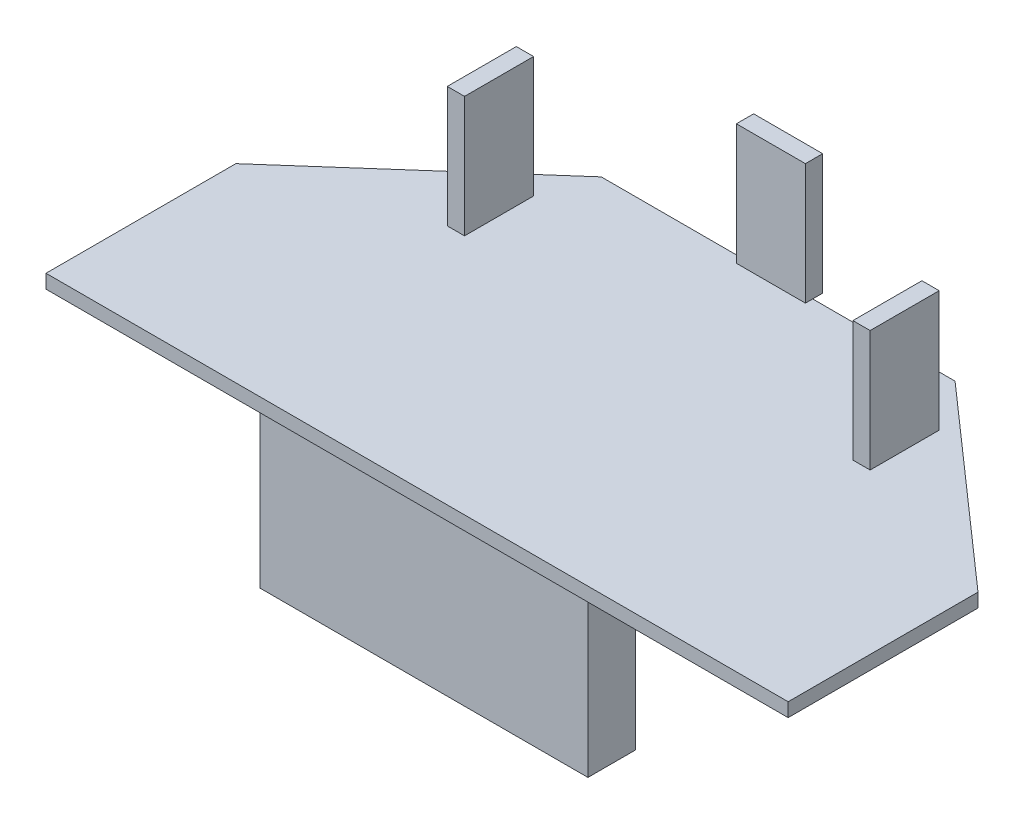
ISO-10303-21;
HEADER;
FILE_DESCRIPTION(('STEP AP214'),'2;1');
FILE_NAME('part.step','',(''),(''),'','','');
FILE_SCHEMA(('AUTOMOTIVE_DESIGN { 1 0 10303 214 1 1 1 1 }'));
ENDSEC;
DATA;
#1=APPLICATION_CONTEXT('core data for automotive mechanical design processes');
#2=APPLICATION_PROTOCOL_DEFINITION('international standard','automotive_design',2000,#1);
#3=PRODUCT_CONTEXT('',#1,'mechanical');
#4=PRODUCT('Part','Part','',(#3));
#5=PRODUCT_RELATED_PRODUCT_CATEGORY('part','',(#4));
#6=PRODUCT_DEFINITION_FORMATION('','',#4);
#7=PRODUCT_DEFINITION_CONTEXT('part definition',#1,'design');
#8=PRODUCT_DEFINITION('design','',#6,#7);
#9=PRODUCT_DEFINITION_SHAPE('','',#8);
#10=(LENGTH_UNIT() NAMED_UNIT(*) SI_UNIT(.MILLI.,.METRE.));
#11=(NAMED_UNIT(*) PLANE_ANGLE_UNIT() SI_UNIT($,.RADIAN.));
#12=(NAMED_UNIT(*) SI_UNIT($,.STERADIAN.) SOLID_ANGLE_UNIT());
#13=UNCERTAINTY_MEASURE_WITH_UNIT(LENGTH_MEASURE(1.E-05),#10,'distance_accuracy_value','');
#14=(GEOMETRIC_REPRESENTATION_CONTEXT(3) GLOBAL_UNCERTAINTY_ASSIGNED_CONTEXT((#13)) GLOBAL_UNIT_ASSIGNED_CONTEXT((#10,
#11,#12)) REPRESENTATION_CONTEXT('',''));
#15=CARTESIAN_POINT('',(0.,0.,0.));
#16=DIRECTION('',(0.,0.,1.));
#17=DIRECTION('',(1.,0.,0.));
#18=AXIS2_PLACEMENT_3D('',#15,#16,#17);
#19=CARTESIAN_POINT('',(0.,0.,0.));
#20=DIRECTION('',(0.,1.,0.));
#21=DIRECTION('',(0.,0.,1.));
#22=AXIS2_PLACEMENT_3D('',#19,#20,#21);
#23=PLANE('',#22);
#24=DIRECTION('',(0.,0.,-1.));
#25=VECTOR('',#24,1.);
#26=CARTESIAN_POINT('',(-22.5,0.,-28.));
#27=LINE('',#26,#25);
#28=CARTESIAN_POINT('',(-22.5,0.,-28.));
#29=VERTEX_POINT('',#28);
#30=CARTESIAN_POINT('',(-22.5,0.,-36.));
#31=VERTEX_POINT('',#30);
#32=EDGE_CURVE('E270',#29,#31,#27,.T.);
#33=ORIENTED_EDGE('',*,*,#32,.F.);
#34=DIRECTION('',(1.,0.,0.));
#35=VECTOR('',#34,1.);
#36=CARTESIAN_POINT('',(-24.5,0.,-28.));
#37=LINE('',#36,#35);
#38=CARTESIAN_POINT('',(-24.5,0.,-28.));
#39=VERTEX_POINT('',#38);
#40=EDGE_CURVE('E256',#39,#29,#37,.T.);
#41=ORIENTED_EDGE('',*,*,#40,.F.);
#42=DIRECTION('',(0.,0.,1.));
#43=VECTOR('',#42,1.);
#44=CARTESIAN_POINT('',(-24.5,0.,-36.));
#45=LINE('',#44,#43);
#46=CARTESIAN_POINT('',(-24.5,0.,-36.));
#47=VERTEX_POINT('',#46);
#48=EDGE_CURVE('E261',#47,#39,#45,.T.);
#49=ORIENTED_EDGE('',*,*,#48,.F.);
#50=DIRECTION('',(-1.,0.,0.));
#51=VECTOR('',#50,1.);
#52=CARTESIAN_POINT('',(-22.5,0.,-36.));
#53=LINE('',#52,#51);
#54=EDGE_CURVE('E272',#31,#47,#53,.T.);
#55=ORIENTED_EDGE('',*,*,#54,.F.);
#56=EDGE_LOOP('',(#33,#41,#49,#55));
#57=FACE_BOUND('',#56,.T.);
#58=DIRECTION('',(1.,0.,0.));
#59=VECTOR('',#58,1.);
#60=CARTESIAN_POINT('',(-4.,0.,-41.));
#61=LINE('',#60,#59);
#62=CARTESIAN_POINT('',(-4.,0.,-41.));
#63=VERTEX_POINT('',#62);
#64=CARTESIAN_POINT('',(4.,0.,-41.));
#65=VERTEX_POINT('',#64);
#66=EDGE_CURVE('E62',#63,#65,#61,.T.);
#67=ORIENTED_EDGE('',*,*,#66,.F.);
#68=DIRECTION('',(0.,0.,1.));
#69=VECTOR('',#68,1.);
#70=CARTESIAN_POINT('',(-4.,0.,-43.));
#71=LINE('',#70,#69);
#72=CARTESIAN_POINT('',(-4.,0.,-41.8431348329844));
#73=VERTEX_POINT('',#72);
#74=EDGE_CURVE('E220',#73,#63,#71,.T.);
#75=ORIENTED_EDGE('',*,*,#74,.F.);
#76=DIRECTION('',(-1.,0.,0.));
#77=VECTOR('',#76,1.);
#78=CARTESIAN_POINT('',(20.5,0.,-41.8431348329844));
#79=LINE('',#78,#77);
#80=CARTESIAN_POINT('',(-20.5,0.,-41.8431348329844));
#81=VERTEX_POINT('',#80);
#82=EDGE_CURVE('E316',#73,#81,#79,.T.);
#83=ORIENTED_EDGE('',*,*,#82,.T.);
#84=DIRECTION('',(-0.75,0.,0.661437827766148));
#85=VECTOR('',#84,1.);
#86=CARTESIAN_POINT('',(-20.5,0.,-41.8431348329844));
#87=LINE('',#86,#85);
#88=CARTESIAN_POINT('',(-43.,0.,-22.));
#89=VERTEX_POINT('',#88);
#90=EDGE_CURVE('E320',#81,#89,#87,.T.);
#91=ORIENTED_EDGE('',*,*,#90,.T.);
#92=DIRECTION('',(0.,0.,1.));
#93=VECTOR('',#92,1.);
#94=CARTESIAN_POINT('',(-43.,0.,-22.));
#95=LINE('',#94,#93);
#96=CARTESIAN_POINT('',(-43.,0.,0.));
#97=VERTEX_POINT('',#96);
#98=EDGE_CURVE('E306',#89,#97,#95,.T.);
#99=ORIENTED_EDGE('',*,*,#98,.T.);
#100=DIRECTION('',(1.,0.,0.));
#101=VECTOR('',#100,1.);
#102=CARTESIAN_POINT('',(-43.,0.,0.));
#103=LINE('',#102,#101);
#104=CARTESIAN_POINT('',(43.,0.,0.));
#105=VERTEX_POINT('',#104);
#106=EDGE_CURVE('E309',#97,#105,#103,.T.);
#107=ORIENTED_EDGE('',*,*,#106,.T.);
#108=DIRECTION('',(0.,0.,-1.));
#109=VECTOR('',#108,1.);
#110=CARTESIAN_POINT('',(43.,0.,0.));
#111=LINE('',#110,#109);
#112=CARTESIAN_POINT('',(43.,0.,-22.));
#113=VERTEX_POINT('',#112);
#114=EDGE_CURVE('E312',#105,#113,#111,.T.);
#115=ORIENTED_EDGE('',*,*,#114,.T.);
#116=DIRECTION('',(-0.75,0.,-0.661437827766148));
#117=VECTOR('',#116,1.);
#118=CARTESIAN_POINT('',(43.,0.,-22.));
#119=LINE('',#118,#117);
#120=CARTESIAN_POINT('',(20.5,0.,-41.8431348329844));
#121=VERTEX_POINT('',#120);
#122=EDGE_CURVE('E314',#113,#121,#119,.T.);
#123=ORIENTED_EDGE('',*,*,#122,.T.);
#124=CARTESIAN_POINT('',(4.,0.,-41.8431348329844));
#125=VERTEX_POINT('',#124);
#126=EDGE_CURVE('E317',#121,#125,#79,.T.);
#127=ORIENTED_EDGE('',*,*,#126,.T.);
#128=DIRECTION('',(0.,0.,-1.));
#129=VECTOR('',#128,1.);
#130=CARTESIAN_POINT('',(4.,0.,-41.));
#131=LINE('',#130,#129);
#132=EDGE_CURVE('E241',#65,#125,#131,.T.);
#133=ORIENTED_EDGE('',*,*,#132,.F.);
#134=EDGE_LOOP('',(#67,#75,#83,#91,#99,#107,#115,#123,#127,#133));
#135=FACE_BOUND('',#134,.T.);
#136=DIRECTION('',(0.,0.,1.));
#137=VECTOR('',#136,1.);
#138=CARTESIAN_POINT('',(22.5,0.,-36.));
#139=LINE('',#138,#137);
#140=CARTESIAN_POINT('',(22.5,0.,-36.));
#141=VERTEX_POINT('',#140);
#142=CARTESIAN_POINT('',(22.5,0.,-28.));
#143=VERTEX_POINT('',#142);
#144=EDGE_CURVE('E621',#141,#143,#139,.T.);
#145=ORIENTED_EDGE('',*,*,#144,.F.);
#146=DIRECTION('',(-1.,0.,0.));
#147=VECTOR('',#146,1.);
#148=CARTESIAN_POINT('',(24.5,0.,-36.));
#149=LINE('',#148,#147);
#150=CARTESIAN_POINT('',(24.5,0.,-36.));
#151=VERTEX_POINT('',#150);
#152=EDGE_CURVE('E218',#151,#141,#149,.T.);
#153=ORIENTED_EDGE('',*,*,#152,.F.);
#154=DIRECTION('',(0.,0.,-1.));
#155=VECTOR('',#154,1.);
#156=CARTESIAN_POINT('',(24.5,0.,-28.));
#157=LINE('',#156,#155);
#158=CARTESIAN_POINT('',(24.5,0.,-28.));
#159=VERTEX_POINT('',#158);
#160=EDGE_CURVE('E214',#159,#151,#157,.T.);
#161=ORIENTED_EDGE('',*,*,#160,.F.);
#162=DIRECTION('',(1.,0.,0.));
#163=VECTOR('',#162,1.);
#164=CARTESIAN_POINT('',(22.5,0.,-28.));
#165=LINE('',#164,#163);
#166=EDGE_CURVE('E618',#143,#159,#165,.T.);
#167=ORIENTED_EDGE('',*,*,#166,.F.);
#168=EDGE_LOOP('',(#145,#153,#161,#167));
#169=FACE_BOUND('',#168,.T.);
#170=ADVANCED_FACE('F39',(#57,#135,#169),#23,.T.);
#171=CARTESIAN_POINT('',(0.,-1.6,0.));
#172=DIRECTION('',(0.,1.,0.));
#173=DIRECTION('',(0.,0.,1.));
#174=AXIS2_PLACEMENT_3D('',#171,#172,#173);
#175=PLANE('',#174);
#176=DIRECTION('',(0.,0.,1.));
#177=VECTOR('',#176,1.);
#178=CARTESIAN_POINT('',(-43.,-1.6,-22.));
#179=LINE('',#178,#177);
#180=CARTESIAN_POINT('',(-43.,-1.6,-22.));
#181=VERTEX_POINT('',#180);
#182=CARTESIAN_POINT('',(-43.,-1.6,0.));
#183=VERTEX_POINT('',#182);
#184=EDGE_CURVE('E305',#181,#183,#179,.T.);
#185=ORIENTED_EDGE('',*,*,#184,.F.);
#186=DIRECTION('',(-0.75,0.,0.661437827766148));
#187=VECTOR('',#186,1.);
#188=CARTESIAN_POINT('',(-20.5,-1.6,-41.8431348329844));
#189=LINE('',#188,#187);
#190=CARTESIAN_POINT('',(-20.5,-1.6,-41.8431348329844));
#191=VERTEX_POINT('',#190);
#192=EDGE_CURVE('E310',#191,#181,#189,.T.);
#193=ORIENTED_EDGE('',*,*,#192,.F.);
#194=DIRECTION('',(-1.,0.,0.));
#195=VECTOR('',#194,1.);
#196=CARTESIAN_POINT('',(20.5,-1.6,-41.8431348329844));
#197=LINE('',#196,#195);
#198=CARTESIAN_POINT('',(20.5,-1.6,-41.8431348329844));
#199=VERTEX_POINT('',#198);
#200=EDGE_CURVE('E332',#199,#191,#197,.T.);
#201=ORIENTED_EDGE('',*,*,#200,.F.);
#202=DIRECTION('',(-0.75,0.,-0.661437827766148));
#203=VECTOR('',#202,1.);
#204=CARTESIAN_POINT('',(43.,-1.6,-22.));
#205=LINE('',#204,#203);
#206=CARTESIAN_POINT('',(43.,-1.6,-22.));
#207=VERTEX_POINT('',#206);
#208=EDGE_CURVE('E330',#207,#199,#205,.T.);
#209=ORIENTED_EDGE('',*,*,#208,.F.);
#210=DIRECTION('',(0.,0.,-1.));
#211=VECTOR('',#210,1.);
#212=CARTESIAN_POINT('',(43.,-1.6,0.));
#213=LINE('',#212,#211);
#214=CARTESIAN_POINT('',(43.,-1.6,0.));
#215=VERTEX_POINT('',#214);
#216=EDGE_CURVE('E328',#215,#207,#213,.T.);
#217=ORIENTED_EDGE('',*,*,#216,.F.);
#218=DIRECTION('',(1.,0.,0.));
#219=VECTOR('',#218,1.);
#220=CARTESIAN_POINT('',(-43.,-1.6,0.));
#221=LINE('',#220,#219);
#222=EDGE_CURVE('E326',#183,#215,#221,.T.);
#223=ORIENTED_EDGE('',*,*,#222,.F.);
#224=EDGE_LOOP('',(#185,#193,#201,#209,#217,#223));
#225=FACE_BOUND('',#224,.T.);
#226=DIRECTION('',(0.,0.,-1.));
#227=VECTOR('',#226,1.);
#228=CARTESIAN_POINT('',(-19.,-1.6,0.));
#229=LINE('',#228,#227);
#230=CARTESIAN_POINT('',(-19.,-1.6,-0.8));
#231=VERTEX_POINT('',#230);
#232=CARTESIAN_POINT('',(-19.,-1.6,-6.3));
#233=VERTEX_POINT('',#232);
#234=EDGE_CURVE('E11',#231,#233,#229,.T.);
#235=ORIENTED_EDGE('',*,*,#234,.F.);
#236=DIRECTION('',(-1.,0.,0.));
#237=VECTOR('',#236,1.);
#238=CARTESIAN_POINT('',(0.,-1.6,-0.8));
#239=LINE('',#238,#237);
#240=CARTESIAN_POINT('',(19.,-1.6,-0.8));
#241=VERTEX_POINT('',#240);
#242=EDGE_CURVE('E47',#241,#231,#239,.T.);
#243=ORIENTED_EDGE('',*,*,#242,.F.);
#244=DIRECTION('',(0.,0.,1.));
#245=VECTOR('',#244,1.);
#246=CARTESIAN_POINT('',(19.,-1.6,0.));
#247=LINE('',#246,#245);
#248=CARTESIAN_POINT('',(19.,-1.6,-6.3));
#249=VERTEX_POINT('',#248);
#250=EDGE_CURVE('E355',#249,#241,#247,.T.);
#251=ORIENTED_EDGE('',*,*,#250,.F.);
#252=DIRECTION('',(1.,0.,0.));
#253=VECTOR('',#252,1.);
#254=CARTESIAN_POINT('',(0.,-1.6,-6.3));
#255=LINE('',#254,#253);
#256=EDGE_CURVE('E352',#233,#249,#255,.T.);
#257=ORIENTED_EDGE('',*,*,#256,.F.);
#258=EDGE_LOOP('',(#235,#243,#251,#257));
#259=FACE_BOUND('',#258,.T.);
#260=ADVANCED_FACE('F375',(#225,#259),#175,.F.);
#261=CARTESIAN_POINT('',(-43.,0.,-22.));
#262=DIRECTION('',(1.,0.,0.));
#263=DIRECTION('',(0.,0.,-1.));
#264=AXIS2_PLACEMENT_3D('',#261,#262,#263);
#265=PLANE('',#264);
#266=ORIENTED_EDGE('',*,*,#184,.T.);
#267=DIRECTION('',(0.,-1.,0.));
#268=VECTOR('',#267,1.);
#269=CARTESIAN_POINT('',(-43.,0.,0.));
#270=LINE('',#269,#268);
#271=EDGE_CURVE('E349',#97,#183,#270,.T.);
#272=ORIENTED_EDGE('',*,*,#271,.F.);
#273=ORIENTED_EDGE('',*,*,#98,.F.);
#274=DIRECTION('',(0.,-1.,0.));
#275=VECTOR('',#274,1.);
#276=CARTESIAN_POINT('',(-43.,0.,-22.));
#277=LINE('',#276,#275);
#278=EDGE_CURVE('E323',#89,#181,#277,.T.);
#279=ORIENTED_EDGE('',*,*,#278,.T.);
#280=EDGE_LOOP('',(#266,#272,#273,#279));
#281=FACE_BOUND('',#280,.T.);
#282=ADVANCED_FACE('F41',(#281),#265,.F.);
#283=CARTESIAN_POINT('',(-43.,0.,0.));
#284=DIRECTION('',(0.,0.,-1.));
#285=DIRECTION('',(-1.,0.,0.));
#286=AXIS2_PLACEMENT_3D('',#283,#284,#285);
#287=PLANE('',#286);
#288=ORIENTED_EDGE('',*,*,#222,.T.);
#289=DIRECTION('',(0.,-1.,0.));
#290=VECTOR('',#289,1.);
#291=CARTESIAN_POINT('',(43.,0.,0.));
#292=LINE('',#291,#290);
#293=EDGE_CURVE('E346',#105,#215,#292,.T.);
#294=ORIENTED_EDGE('',*,*,#293,.F.);
#295=ORIENTED_EDGE('',*,*,#106,.F.);
#296=ORIENTED_EDGE('',*,*,#271,.T.);
#297=EDGE_LOOP('',(#288,#294,#295,#296));
#298=FACE_BOUND('',#297,.T.);
#299=ADVANCED_FACE('F415',(#298),#287,.F.);
#300=CARTESIAN_POINT('',(43.,0.,0.));
#301=DIRECTION('',(-1.,0.,0.));
#302=DIRECTION('',(0.,0.,1.));
#303=AXIS2_PLACEMENT_3D('',#300,#301,#302);
#304=PLANE('',#303);
#305=ORIENTED_EDGE('',*,*,#216,.T.);
#306=DIRECTION('',(0.,-1.,0.));
#307=VECTOR('',#306,1.);
#308=CARTESIAN_POINT('',(43.,0.,-22.));
#309=LINE('',#308,#307);
#310=EDGE_CURVE('E343',#113,#207,#309,.T.);
#311=ORIENTED_EDGE('',*,*,#310,.F.);
#312=ORIENTED_EDGE('',*,*,#114,.F.);
#313=ORIENTED_EDGE('',*,*,#293,.T.);
#314=EDGE_LOOP('',(#305,#311,#312,#313));
#315=FACE_BOUND('',#314,.T.);
#316=ADVANCED_FACE('F412',(#315),#304,.F.);
#317=CARTESIAN_POINT('',(43.,0.,-22.));
#318=DIRECTION('',(-0.661437827766148,0.,0.75));
#319=DIRECTION('',(0.75,0.,0.661437827766148));
#320=AXIS2_PLACEMENT_3D('',#317,#318,#319);
#321=PLANE('',#320);
#322=ORIENTED_EDGE('',*,*,#208,.T.);
#323=DIRECTION('',(0.,-1.,0.));
#324=VECTOR('',#323,1.);
#325=CARTESIAN_POINT('',(20.5,0.,-41.8431348329844));
#326=LINE('',#325,#324);
#327=EDGE_CURVE('E340',#121,#199,#326,.T.);
#328=ORIENTED_EDGE('',*,*,#327,.F.);
#329=ORIENTED_EDGE('',*,*,#122,.F.);
#330=ORIENTED_EDGE('',*,*,#310,.T.);
#331=EDGE_LOOP('',(#322,#328,#329,#330));
#332=FACE_BOUND('',#331,.T.);
#333=ADVANCED_FACE('F408',(#332),#321,.F.);
#334=CARTESIAN_POINT('',(20.5,0.,-41.8431348329844));
#335=DIRECTION('',(0.,0.,1.));
#336=DIRECTION('',(1.,0.,0.));
#337=AXIS2_PLACEMENT_3D('',#334,#335,#336);
#338=PLANE('',#337);
#339=ORIENTED_EDGE('',*,*,#200,.T.);
#340=DIRECTION('',(0.,-1.,0.));
#341=VECTOR('',#340,1.);
#342=CARTESIAN_POINT('',(-20.5,0.,-41.8431348329844));
#343=LINE('',#342,#341);
#344=EDGE_CURVE('E337',#81,#191,#343,.T.);
#345=ORIENTED_EDGE('',*,*,#344,.F.);
#346=ORIENTED_EDGE('',*,*,#82,.F.);
#347=EDGE_CURVE('E321',#125,#73,#79,.T.);
#348=ORIENTED_EDGE('',*,*,#347,.F.);
#349=ORIENTED_EDGE('',*,*,#126,.F.);
#350=ORIENTED_EDGE('',*,*,#327,.T.);
#351=EDGE_LOOP('',(#339,#345,#346,#348,#349,#350));
#352=FACE_BOUND('',#351,.T.);
#353=ADVANCED_FACE('F404',(#352),#338,.F.);
#354=CARTESIAN_POINT('',(-20.5,0.,-41.8431348329844));
#355=DIRECTION('',(0.661437827766148,0.,0.75));
#356=DIRECTION('',(0.75,0.,-0.661437827766148));
#357=AXIS2_PLACEMENT_3D('',#354,#355,#356);
#358=PLANE('',#357);
#359=ORIENTED_EDGE('',*,*,#192,.T.);
#360=ORIENTED_EDGE('',*,*,#278,.F.);
#361=ORIENTED_EDGE('',*,*,#90,.F.);
#362=ORIENTED_EDGE('',*,*,#344,.T.);
#363=EDGE_LOOP('',(#359,#360,#361,#362));
#364=FACE_BOUND('',#363,.T.);
#365=ADVANCED_FACE('F401',(#364),#358,.F.);
#366=CARTESIAN_POINT('',(-19.,0.,-6.3));
#367=DIRECTION('',(1.,0.,0.));
#368=DIRECTION('',(0.,0.,-1.));
#369=AXIS2_PLACEMENT_3D('',#366,#367,#368);
#370=PLANE('',#369);
#371=DIRECTION('',(0.,-1.,0.));
#372=VECTOR('',#371,1.);
#373=CARTESIAN_POINT('',(-19.,0.,-0.8));
#374=LINE('',#373,#372);
#375=CARTESIAN_POINT('',(-19.,-20.,-0.8));
#376=VERTEX_POINT('',#375);
#377=EDGE_CURVE('E303',#231,#376,#374,.T.);
#378=ORIENTED_EDGE('',*,*,#377,.F.);
#379=ORIENTED_EDGE('',*,*,#234,.T.);
#380=DIRECTION('',(0.,-1.,0.));
#381=VECTOR('',#380,1.);
#382=CARTESIAN_POINT('',(-19.,0.,-6.3));
#383=LINE('',#382,#381);
#384=CARTESIAN_POINT('',(-19.,-20.,-6.3));
#385=VERTEX_POINT('',#384);
#386=EDGE_CURVE('E297',#233,#385,#383,.T.);
#387=ORIENTED_EDGE('',*,*,#386,.T.);
#388=DIRECTION('',(0.,0.,1.));
#389=VECTOR('',#388,1.);
#390=CARTESIAN_POINT('',(-19.,-20.,-6.3));
#391=LINE('',#390,#389);
#392=EDGE_CURVE('E285',#385,#376,#391,.T.);
#393=ORIENTED_EDGE('',*,*,#392,.T.);
#394=EDGE_LOOP('',(#378,#379,#387,#393));
#395=FACE_BOUND('',#394,.T.);
#396=ADVANCED_FACE('F365',(#395),#370,.F.);
#397=CARTESIAN_POINT('',(-19.,0.,-0.8));
#398=DIRECTION('',(0.,0.,-1.));
#399=DIRECTION('',(-1.,0.,0.));
#400=AXIS2_PLACEMENT_3D('',#397,#398,#399);
#401=PLANE('',#400);
#402=DIRECTION('',(0.,-1.,0.));
#403=VECTOR('',#402,1.);
#404=CARTESIAN_POINT('',(19.,0.,-0.8));
#405=LINE('',#404,#403);
#406=CARTESIAN_POINT('',(19.,-20.,-0.8));
#407=VERTEX_POINT('',#406);
#408=EDGE_CURVE('E301',#241,#407,#405,.T.);
#409=ORIENTED_EDGE('',*,*,#408,.F.);
#410=ORIENTED_EDGE('',*,*,#242,.T.);
#411=ORIENTED_EDGE('',*,*,#377,.T.);
#412=DIRECTION('',(1.,0.,0.));
#413=VECTOR('',#412,1.);
#414=CARTESIAN_POINT('',(-19.,-20.,-0.8));
#415=LINE('',#414,#413);
#416=EDGE_CURVE('E288',#376,#407,#415,.T.);
#417=ORIENTED_EDGE('',*,*,#416,.T.);
#418=EDGE_LOOP('',(#409,#410,#411,#417));
#419=FACE_BOUND('',#418,.T.);
#420=ADVANCED_FACE('F361',(#419),#401,.F.);
#421=CARTESIAN_POINT('',(19.,0.,-0.8));
#422=DIRECTION('',(-1.,0.,0.));
#423=DIRECTION('',(0.,0.,1.));
#424=AXIS2_PLACEMENT_3D('',#421,#422,#423);
#425=PLANE('',#424);
#426=DIRECTION('',(0.,-1.,0.));
#427=VECTOR('',#426,1.);
#428=CARTESIAN_POINT('',(19.,0.,-6.3));
#429=LINE('',#428,#427);
#430=CARTESIAN_POINT('',(19.,-20.,-6.3));
#431=VERTEX_POINT('',#430);
#432=EDGE_CURVE('E299',#249,#431,#429,.T.);
#433=ORIENTED_EDGE('',*,*,#432,.F.);
#434=ORIENTED_EDGE('',*,*,#250,.T.);
#435=ORIENTED_EDGE('',*,*,#408,.T.);
#436=DIRECTION('',(0.,0.,-1.));
#437=VECTOR('',#436,1.);
#438=CARTESIAN_POINT('',(19.,-20.,-0.8));
#439=LINE('',#438,#437);
#440=EDGE_CURVE('E291',#407,#431,#439,.T.);
#441=ORIENTED_EDGE('',*,*,#440,.T.);
#442=EDGE_LOOP('',(#433,#434,#435,#441));
#443=FACE_BOUND('',#442,.T.);
#444=ADVANCED_FACE('F374',(#443),#425,.F.);
#445=CARTESIAN_POINT('',(19.,0.,-6.3));
#446=DIRECTION('',(0.,0.,1.));
#447=DIRECTION('',(1.,0.,0.));
#448=AXIS2_PLACEMENT_3D('',#445,#446,#447);
#449=PLANE('',#448);
#450=ORIENTED_EDGE('',*,*,#386,.F.);
#451=ORIENTED_EDGE('',*,*,#256,.T.);
#452=ORIENTED_EDGE('',*,*,#432,.T.);
#453=DIRECTION('',(-1.,0.,0.));
#454=VECTOR('',#453,1.);
#455=CARTESIAN_POINT('',(19.,-20.,-6.3));
#456=LINE('',#455,#454);
#457=EDGE_CURVE('E294',#431,#385,#456,.T.);
#458=ORIENTED_EDGE('',*,*,#457,.T.);
#459=EDGE_LOOP('',(#450,#451,#452,#458));
#460=FACE_BOUND('',#459,.T.);
#461=ADVANCED_FACE('F377',(#460),#449,.F.);
#462=CARTESIAN_POINT('',(0.,-20.,0.));
#463=DIRECTION('',(0.,1.,0.));
#464=DIRECTION('',(0.,0.,1.));
#465=AXIS2_PLACEMENT_3D('',#462,#463,#464);
#466=PLANE('',#465);
#467=ORIENTED_EDGE('',*,*,#392,.F.);
#468=ORIENTED_EDGE('',*,*,#457,.F.);
#469=ORIENTED_EDGE('',*,*,#440,.F.);
#470=ORIENTED_EDGE('',*,*,#416,.F.);
#471=EDGE_LOOP('',(#467,#468,#469,#470));
#472=FACE_BOUND('',#471,.T.);
#473=ADVANCED_FACE('F370',(#472),#466,.F.);
#474=CARTESIAN_POINT('',(-24.5,14.,-28.));
#475=DIRECTION('',(0.,0.,-1.));
#476=DIRECTION('',(-1.,0.,0.));
#477=AXIS2_PLACEMENT_3D('',#474,#475,#476);
#478=PLANE('',#477);
#479=ORIENTED_EDGE('',*,*,#40,.T.);
#480=DIRECTION('',(0.,-1.,0.));
#481=VECTOR('',#480,1.);
#482=CARTESIAN_POINT('',(-22.5,14.,-28.));
#483=LINE('',#482,#481);
#484=CARTESIAN_POINT('',(-22.5,14.,-28.));
#485=VERTEX_POINT('',#484);
#486=EDGE_CURVE('E283',#485,#29,#483,.T.);
#487=ORIENTED_EDGE('',*,*,#486,.F.);
#488=DIRECTION('',(1.,0.,0.));
#489=VECTOR('',#488,1.);
#490=CARTESIAN_POINT('',(-24.5,14.,-28.));
#491=LINE('',#490,#489);
#492=CARTESIAN_POINT('',(-24.5,14.,-28.));
#493=VERTEX_POINT('',#492);
#494=EDGE_CURVE('E257',#493,#485,#491,.T.);
#495=ORIENTED_EDGE('',*,*,#494,.F.);
#496=DIRECTION('',(0.,-1.,0.));
#497=VECTOR('',#496,1.);
#498=CARTESIAN_POINT('',(-24.5,14.,-28.));
#499=LINE('',#498,#497);
#500=EDGE_CURVE('E267',#493,#39,#499,.T.);
#501=ORIENTED_EDGE('',*,*,#500,.T.);
#502=EDGE_LOOP('',(#479,#487,#495,#501));
#503=FACE_BOUND('',#502,.T.);
#504=ADVANCED_FACE('F384',(#503),#478,.F.);
#505=CARTESIAN_POINT('',(-22.5,14.,-28.));
#506=DIRECTION('',(-1.,0.,0.));
#507=DIRECTION('',(0.,0.,1.));
#508=AXIS2_PLACEMENT_3D('',#505,#506,#507);
#509=PLANE('',#508);
#510=ORIENTED_EDGE('',*,*,#32,.T.);
#511=DIRECTION('',(0.,-1.,0.));
#512=VECTOR('',#511,1.);
#513=CARTESIAN_POINT('',(-22.5,14.,-36.));
#514=LINE('',#513,#512);
#515=CARTESIAN_POINT('',(-22.5,14.,-36.));
#516=VERTEX_POINT('',#515);
#517=EDGE_CURVE('E280',#516,#31,#514,.T.);
#518=ORIENTED_EDGE('',*,*,#517,.F.);
#519=DIRECTION('',(0.,0.,-1.));
#520=VECTOR('',#519,1.);
#521=CARTESIAN_POINT('',(-22.5,14.,-28.));
#522=LINE('',#521,#520);
#523=EDGE_CURVE('E260',#485,#516,#522,.T.);
#524=ORIENTED_EDGE('',*,*,#523,.F.);
#525=ORIENTED_EDGE('',*,*,#486,.T.);
#526=EDGE_LOOP('',(#510,#518,#524,#525));
#527=FACE_BOUND('',#526,.T.);
#528=ADVANCED_FACE('F490',(#527),#509,.F.);
#529=CARTESIAN_POINT('',(-22.5,14.,-36.));
#530=DIRECTION('',(0.,0.,1.));
#531=DIRECTION('',(1.,0.,0.));
#532=AXIS2_PLACEMENT_3D('',#529,#530,#531);
#533=PLANE('',#532);
#534=ORIENTED_EDGE('',*,*,#54,.T.);
#535=DIRECTION('',(0.,-1.,0.));
#536=VECTOR('',#535,1.);
#537=CARTESIAN_POINT('',(-24.5,14.,-36.));
#538=LINE('',#537,#536);
#539=CARTESIAN_POINT('',(-24.5,14.,-36.));
#540=VERTEX_POINT('',#539);
#541=EDGE_CURVE('E278',#540,#47,#538,.T.);
#542=ORIENTED_EDGE('',*,*,#541,.F.);
#543=DIRECTION('',(-1.,0.,0.));
#544=VECTOR('',#543,1.);
#545=CARTESIAN_POINT('',(-22.5,14.,-36.));
#546=LINE('',#545,#544);
#547=EDGE_CURVE('E263',#516,#540,#546,.T.);
#548=ORIENTED_EDGE('',*,*,#547,.F.);
#549=ORIENTED_EDGE('',*,*,#517,.T.);
#550=EDGE_LOOP('',(#534,#542,#548,#549));
#551=FACE_BOUND('',#550,.T.);
#552=ADVANCED_FACE('F486',(#551),#533,.F.);
#553=CARTESIAN_POINT('',(-24.5,14.,-36.));
#554=DIRECTION('',(1.,0.,0.));
#555=DIRECTION('',(0.,0.,-1.));
#556=AXIS2_PLACEMENT_3D('',#553,#554,#555);
#557=PLANE('',#556);
#558=ORIENTED_EDGE('',*,*,#48,.T.);
#559=ORIENTED_EDGE('',*,*,#500,.F.);
#560=DIRECTION('',(0.,0.,1.));
#561=VECTOR('',#560,1.);
#562=CARTESIAN_POINT('',(-24.5,14.,-36.));
#563=LINE('',#562,#561);
#564=EDGE_CURVE('E265',#540,#493,#563,.T.);
#565=ORIENTED_EDGE('',*,*,#564,.F.);
#566=ORIENTED_EDGE('',*,*,#541,.T.);
#567=EDGE_LOOP('',(#558,#559,#565,#566));
#568=FACE_BOUND('',#567,.T.);
#569=ADVANCED_FACE('F482',(#568),#557,.F.);
#570=CARTESIAN_POINT('',(0.,14.,0.));
#571=DIRECTION('',(0.,1.,0.));
#572=DIRECTION('',(0.,0.,1.));
#573=AXIS2_PLACEMENT_3D('',#570,#571,#572);
#574=PLANE('',#573);
#575=ORIENTED_EDGE('',*,*,#494,.T.);
#576=ORIENTED_EDGE('',*,*,#523,.T.);
#577=ORIENTED_EDGE('',*,*,#547,.T.);
#578=ORIENTED_EDGE('',*,*,#564,.T.);
#579=EDGE_LOOP('',(#575,#576,#577,#578));
#580=FACE_BOUND('',#579,.T.);
#581=ADVANCED_FACE('F472',(#580),#574,.T.);
#582=CARTESIAN_POINT('',(0.,0.,0.));
#583=DIRECTION('',(0.,1.,0.));
#584=DIRECTION('',(0.,0.,1.));
#585=AXIS2_PLACEMENT_3D('',#582,#583,#584);
#586=PLANE('',#585);
#587=CARTESIAN_POINT('',(4.,0.,-43.));
#588=VERTEX_POINT('',#587);
#589=EDGE_CURVE('E240',#125,#588,#131,.T.);
#590=ORIENTED_EDGE('',*,*,#589,.F.);
#591=ORIENTED_EDGE('',*,*,#347,.T.);
#592=CARTESIAN_POINT('',(-4.,0.,-43.));
#593=VERTEX_POINT('',#592);
#594=EDGE_CURVE('E222',#593,#73,#71,.T.);
#595=ORIENTED_EDGE('',*,*,#594,.F.);
#596=DIRECTION('',(-1.,0.,0.));
#597=VECTOR('',#596,1.);
#598=CARTESIAN_POINT('',(4.,0.,-43.));
#599=LINE('',#598,#597);
#600=EDGE_CURVE('E231',#588,#593,#599,.T.);
#601=ORIENTED_EDGE('',*,*,#600,.F.);
#602=EDGE_LOOP('',(#590,#591,#595,#601));
#603=FACE_BOUND('',#602,.T.);
#604=ADVANCED_FACE('F441',(#603),#586,.F.);
#605=CARTESIAN_POINT('',(-4.,14.,-43.));
#606=DIRECTION('',(1.,0.,0.));
#607=DIRECTION('',(0.,0.,-1.));
#608=AXIS2_PLACEMENT_3D('',#605,#606,#607);
#609=PLANE('',#608);
#610=ORIENTED_EDGE('',*,*,#594,.T.);
#611=ORIENTED_EDGE('',*,*,#74,.T.);
#612=DIRECTION('',(0.,-1.,0.));
#613=VECTOR('',#612,1.);
#614=CARTESIAN_POINT('',(-4.,14.,-41.));
#615=LINE('',#614,#613);
#616=CARTESIAN_POINT('',(-4.,14.,-41.));
#617=VERTEX_POINT('',#616);
#618=EDGE_CURVE('E253',#617,#63,#615,.T.);
#619=ORIENTED_EDGE('',*,*,#618,.F.);
#620=DIRECTION('',(0.,0.,1.));
#621=VECTOR('',#620,1.);
#622=CARTESIAN_POINT('',(-4.,14.,-43.));
#623=LINE('',#622,#621);
#624=CARTESIAN_POINT('',(-4.,14.,-43.));
#625=VERTEX_POINT('',#624);
#626=EDGE_CURVE('E227',#625,#617,#623,.T.);
#627=ORIENTED_EDGE('',*,*,#626,.F.);
#628=DIRECTION('',(0.,-1.,0.));
#629=VECTOR('',#628,1.);
#630=CARTESIAN_POINT('',(-4.,14.,-43.));
#631=LINE('',#630,#629);
#632=EDGE_CURVE('E236',#625,#593,#631,.T.);
#633=ORIENTED_EDGE('',*,*,#632,.T.);
#634=EDGE_LOOP('',(#610,#611,#619,#627,#633));
#635=FACE_BOUND('',#634,.T.);
#636=ADVANCED_FACE('F453',(#635),#609,.F.);
#637=CARTESIAN_POINT('',(-4.,14.,-41.));
#638=DIRECTION('',(0.,0.,-1.));
#639=DIRECTION('',(-1.,0.,0.));
#640=AXIS2_PLACEMENT_3D('',#637,#638,#639);
#641=PLANE('',#640);
#642=ORIENTED_EDGE('',*,*,#66,.T.);
#643=DIRECTION('',(0.,-1.,0.));
#644=VECTOR('',#643,1.);
#645=CARTESIAN_POINT('',(4.,14.,-41.));
#646=LINE('',#645,#644);
#647=CARTESIAN_POINT('',(4.,14.,-41.));
#648=VERTEX_POINT('',#647);
#649=EDGE_CURVE('E250',#648,#65,#646,.T.);
#650=ORIENTED_EDGE('',*,*,#649,.F.);
#651=DIRECTION('',(1.,0.,0.));
#652=VECTOR('',#651,1.);
#653=CARTESIAN_POINT('',(-4.,14.,-41.));
#654=LINE('',#653,#652);
#655=EDGE_CURVE('E230',#617,#648,#654,.T.);
#656=ORIENTED_EDGE('',*,*,#655,.F.);
#657=ORIENTED_EDGE('',*,*,#618,.T.);
#658=EDGE_LOOP('',(#642,#650,#656,#657));
#659=FACE_BOUND('',#658,.T.);
#660=ADVANCED_FACE('F449',(#659),#641,.F.);
#661=CARTESIAN_POINT('',(4.,14.,-41.));
#662=DIRECTION('',(-1.,0.,0.));
#663=DIRECTION('',(0.,0.,1.));
#664=AXIS2_PLACEMENT_3D('',#661,#662,#663);
#665=PLANE('',#664);
#666=ORIENTED_EDGE('',*,*,#132,.T.);
#667=ORIENTED_EDGE('',*,*,#589,.T.);
#668=DIRECTION('',(0.,-1.,0.));
#669=VECTOR('',#668,1.);
#670=CARTESIAN_POINT('',(4.,14.,-43.));
#671=LINE('',#670,#669);
#672=CARTESIAN_POINT('',(4.,14.,-43.));
#673=VERTEX_POINT('',#672);
#674=EDGE_CURVE('E247',#673,#588,#671,.T.);
#675=ORIENTED_EDGE('',*,*,#674,.F.);
#676=DIRECTION('',(0.,0.,-1.));
#677=VECTOR('',#676,1.);
#678=CARTESIAN_POINT('',(4.,14.,-41.));
#679=LINE('',#678,#677);
#680=EDGE_CURVE('E233',#648,#673,#679,.T.);
#681=ORIENTED_EDGE('',*,*,#680,.F.);
#682=ORIENTED_EDGE('',*,*,#649,.T.);
#683=EDGE_LOOP('',(#666,#667,#675,#681,#682));
#684=FACE_BOUND('',#683,.T.);
#685=ADVANCED_FACE('F445',(#684),#665,.F.);
#686=CARTESIAN_POINT('',(4.,14.,-43.));
#687=DIRECTION('',(0.,0.,1.));
#688=DIRECTION('',(1.,0.,0.));
#689=AXIS2_PLACEMENT_3D('',#686,#687,#688);
#690=PLANE('',#689);
#691=ORIENTED_EDGE('',*,*,#600,.T.);
#692=ORIENTED_EDGE('',*,*,#632,.F.);
#693=DIRECTION('',(-1.,0.,0.));
#694=VECTOR('',#693,1.);
#695=CARTESIAN_POINT('',(4.,14.,-43.));
#696=LINE('',#695,#694);
#697=EDGE_CURVE('E235',#673,#625,#696,.T.);
#698=ORIENTED_EDGE('',*,*,#697,.F.);
#699=ORIENTED_EDGE('',*,*,#674,.T.);
#700=EDGE_LOOP('',(#691,#692,#698,#699));
#701=FACE_BOUND('',#700,.T.);
#702=ADVANCED_FACE('F460',(#701),#690,.F.);
#703=CARTESIAN_POINT('',(0.,14.,0.));
#704=DIRECTION('',(0.,1.,0.));
#705=DIRECTION('',(0.,0.,1.));
#706=AXIS2_PLACEMENT_3D('',#703,#704,#705);
#707=PLANE('',#706);
#708=ORIENTED_EDGE('',*,*,#626,.T.);
#709=ORIENTED_EDGE('',*,*,#655,.T.);
#710=ORIENTED_EDGE('',*,*,#680,.T.);
#711=ORIENTED_EDGE('',*,*,#697,.T.);
#712=EDGE_LOOP('',(#708,#709,#710,#711));
#713=FACE_BOUND('',#712,.T.);
#714=ADVANCED_FACE('F462',(#713),#707,.T.);
#715=CARTESIAN_POINT('',(24.5,14.,-36.));
#716=DIRECTION('',(0.,0.,1.));
#717=DIRECTION('',(1.,0.,0.));
#718=AXIS2_PLACEMENT_3D('',#715,#716,#717);
#719=PLANE('',#718);
#720=ORIENTED_EDGE('',*,*,#152,.T.);
#721=DIRECTION('',(0.,-1.,0.));
#722=VECTOR('',#721,1.);
#723=CARTESIAN_POINT('',(22.5,14.,-36.));
#724=LINE('',#723,#722);
#725=CARTESIAN_POINT('',(22.5,14.,-36.));
#726=VERTEX_POINT('',#725);
#727=EDGE_CURVE('E199',#726,#141,#724,.T.);
#728=ORIENTED_EDGE('',*,*,#727,.F.);
#729=DIRECTION('',(-1.,0.,0.));
#730=VECTOR('',#729,1.);
#731=CARTESIAN_POINT('',(24.5,14.,-36.));
#732=LINE('',#731,#730);
#733=CARTESIAN_POINT('',(24.5,14.,-36.));
#734=VERTEX_POINT('',#733);
#735=EDGE_CURVE('E206',#734,#726,#732,.T.);
#736=ORIENTED_EDGE('',*,*,#735,.F.);
#737=DIRECTION('',(0.,-1.,0.));
#738=VECTOR('',#737,1.);
#739=CARTESIAN_POINT('',(24.5,14.,-36.));
#740=LINE('',#739,#738);
#741=EDGE_CURVE('E616',#734,#151,#740,.T.);
#742=ORIENTED_EDGE('',*,*,#741,.T.);
#743=EDGE_LOOP('',(#720,#728,#736,#742));
#744=FACE_BOUND('',#743,.T.);
#745=ADVANCED_FACE('F216',(#744),#719,.F.);
#746=CARTESIAN_POINT('',(22.5,14.,-36.));
#747=DIRECTION('',(1.,0.,0.));
#748=DIRECTION('',(0.,0.,-1.));
#749=AXIS2_PLACEMENT_3D('',#746,#747,#748);
#750=PLANE('',#749);
#751=ORIENTED_EDGE('',*,*,#144,.T.);
#752=DIRECTION('',(0.,-1.,0.));
#753=VECTOR('',#752,1.);
#754=CARTESIAN_POINT('',(22.5,14.,-28.));
#755=LINE('',#754,#753);
#756=CARTESIAN_POINT('',(22.5,14.,-28.));
#757=VERTEX_POINT('',#756);
#758=EDGE_CURVE('E202',#757,#143,#755,.T.);
#759=ORIENTED_EDGE('',*,*,#758,.F.);
#760=DIRECTION('',(0.,0.,1.));
#761=VECTOR('',#760,1.);
#762=CARTESIAN_POINT('',(22.5,14.,-36.));
#763=LINE('',#762,#761);
#764=EDGE_CURVE('E195',#726,#757,#763,.T.);
#765=ORIENTED_EDGE('',*,*,#764,.F.);
#766=ORIENTED_EDGE('',*,*,#727,.T.);
#767=EDGE_LOOP('',(#751,#759,#765,#766));
#768=FACE_BOUND('',#767,.T.);
#769=ADVANCED_FACE('F197',(#768),#750,.F.);
#770=CARTESIAN_POINT('',(22.5,14.,-28.));
#771=DIRECTION('',(0.,0.,-1.));
#772=DIRECTION('',(-1.,0.,0.));
#773=AXIS2_PLACEMENT_3D('',#770,#771,#772);
#774=PLANE('',#773);
#775=ORIENTED_EDGE('',*,*,#166,.T.);
#776=DIRECTION('',(0.,-1.,0.));
#777=VECTOR('',#776,1.);
#778=CARTESIAN_POINT('',(24.5,14.,-28.));
#779=LINE('',#778,#777);
#780=CARTESIAN_POINT('',(24.5,14.,-28.));
#781=VERTEX_POINT('',#780);
#782=EDGE_CURVE('E54',#781,#159,#779,.T.);
#783=ORIENTED_EDGE('',*,*,#782,.F.);
#784=DIRECTION('',(1.,0.,0.));
#785=VECTOR('',#784,1.);
#786=CARTESIAN_POINT('',(22.5,14.,-28.));
#787=LINE('',#786,#785);
#788=EDGE_CURVE('E205',#757,#781,#787,.T.);
#789=ORIENTED_EDGE('',*,*,#788,.F.);
#790=ORIENTED_EDGE('',*,*,#758,.T.);
#791=EDGE_LOOP('',(#775,#783,#789,#790));
#792=FACE_BOUND('',#791,.T.);
#793=ADVANCED_FACE('F587',(#792),#774,.F.);
#794=CARTESIAN_POINT('',(24.5,14.,-28.));
#795=DIRECTION('',(-1.,0.,0.));
#796=DIRECTION('',(0.,0.,1.));
#797=AXIS2_PLACEMENT_3D('',#794,#795,#796);
#798=PLANE('',#797);
#799=ORIENTED_EDGE('',*,*,#160,.T.);
#800=ORIENTED_EDGE('',*,*,#741,.F.);
#801=DIRECTION('',(0.,0.,-1.));
#802=VECTOR('',#801,1.);
#803=CARTESIAN_POINT('',(24.5,14.,-28.));
#804=LINE('',#803,#802);
#805=EDGE_CURVE('E210',#781,#734,#804,.T.);
#806=ORIENTED_EDGE('',*,*,#805,.F.);
#807=ORIENTED_EDGE('',*,*,#782,.T.);
#808=EDGE_LOOP('',(#799,#800,#806,#807));
#809=FACE_BOUND('',#808,.T.);
#810=ADVANCED_FACE('F595',(#809),#798,.F.);
#811=CARTESIAN_POINT('',(0.,14.,0.));
#812=DIRECTION('',(0.,1.,0.));
#813=DIRECTION('',(0.,0.,1.));
#814=AXIS2_PLACEMENT_3D('',#811,#812,#813);
#815=PLANE('',#814);
#816=ORIENTED_EDGE('',*,*,#735,.T.);
#817=ORIENTED_EDGE('',*,*,#764,.T.);
#818=ORIENTED_EDGE('',*,*,#788,.T.);
#819=ORIENTED_EDGE('',*,*,#805,.T.);
#820=EDGE_LOOP('',(#816,#817,#818,#819));
#821=FACE_BOUND('',#820,.T.);
#822=ADVANCED_FACE('F209',(#821),#815,.T.);
#823=CLOSED_SHELL('',(#170,#260,#282,#299,#316,#333,#353,#365,#396,#420,#444,#461,#473,#504,
#528,#552,#569,#581,#604,#636,#660,#685,#702,#714,#745,#769,#793,#810,#822));
#824=MANIFOLD_SOLID_BREP('B2',#823);
#825=ADVANCED_BREP_SHAPE_REPRESENTATION('',(#18,#824),#14);
#826=SHAPE_DEFINITION_REPRESENTATION(#9,#825);
ENDSEC;
END-ISO-10303-21;
